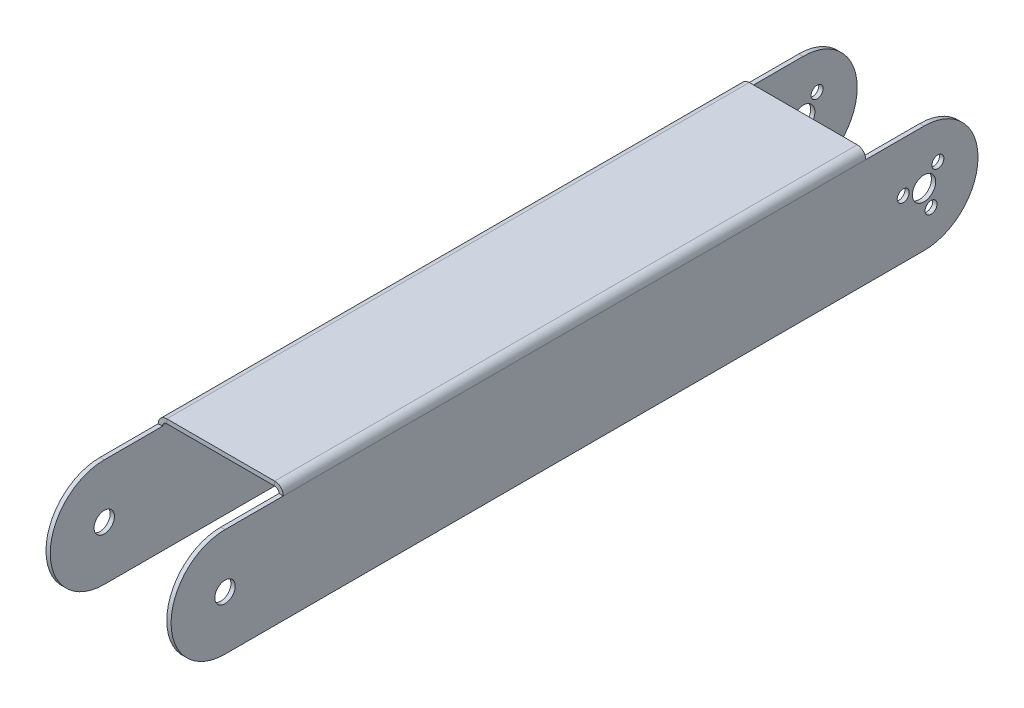
ISO-10303-21;
HEADER;
FILE_DESCRIPTION(('STEP AP214'),'2;1');
FILE_NAME('part.step','',(''),(''),'','','');
FILE_SCHEMA(('AUTOMOTIVE_DESIGN { 1 0 10303 214 1 1 1 1 }'));
ENDSEC;
DATA;
#1=APPLICATION_CONTEXT('core data for automotive mechanical design processes');
#2=APPLICATION_PROTOCOL_DEFINITION('international standard','automotive_design',2000,#1);
#3=PRODUCT_CONTEXT('',#1,'mechanical');
#4=PRODUCT('Part','Part','',(#3));
#5=PRODUCT_RELATED_PRODUCT_CATEGORY('part','',(#4));
#6=PRODUCT_DEFINITION_FORMATION('','',#4);
#7=PRODUCT_DEFINITION_CONTEXT('part definition',#1,'design');
#8=PRODUCT_DEFINITION('design','',#6,#7);
#9=PRODUCT_DEFINITION_SHAPE('','',#8);
#10=(LENGTH_UNIT() NAMED_UNIT(*) SI_UNIT(.MILLI.,.METRE.));
#11=(NAMED_UNIT(*) PLANE_ANGLE_UNIT() SI_UNIT($,.RADIAN.));
#12=(NAMED_UNIT(*) SI_UNIT($,.STERADIAN.) SOLID_ANGLE_UNIT());
#13=UNCERTAINTY_MEASURE_WITH_UNIT(LENGTH_MEASURE(1.E-05),#10,'distance_accuracy_value','');
#14=(GEOMETRIC_REPRESENTATION_CONTEXT(3) GLOBAL_UNCERTAINTY_ASSIGNED_CONTEXT((#13)) GLOBAL_UNIT_ASSIGNED_CONTEXT((#10,
#11,#12)) REPRESENTATION_CONTEXT('',''));
#15=CARTESIAN_POINT('',(0.,0.,0.));
#16=DIRECTION('',(0.,0.,1.));
#17=DIRECTION('',(1.,0.,0.));
#18=AXIS2_PLACEMENT_3D('',#15,#16,#17);
#19=CARTESIAN_POINT('',(10.7366,0.,0.));
#20=DIRECTION('',(-1.,0.,0.));
#21=DIRECTION('',(0.,-1.,0.));
#22=AXIS2_PLACEMENT_3D('',#19,#20,#21);
#23=PLANE('',#22);
#24=CARTESIAN_POINT('',(10.7366000000014,-10.0589967095719,-56.4222899495629));
#25=DIRECTION('',(1.,0.,0.));
#26=DIRECTION('',(0.,0.,-1.));
#27=AXIS2_PLACEMENT_3D('',#24,#25,#26);
#28=CIRCLE('',#27,1.02499999999999);
#29=CARTESIAN_POINT('',(10.7366000000014,-10.0589967095719,-57.4472899495629));
#30=VERTEX_POINT('',#29);
#31=EDGE_CURVE('E467',#30,#30,#28,.T.);
#32=ORIENTED_EDGE('',*,*,#31,.F.);
#33=EDGE_LOOP('',(#32));
#34=FACE_BOUND('',#33,.T.);
#35=CARTESIAN_POINT('',(10.7366,-10.7366,60.));
#36=DIRECTION('',(1.,0.,0.));
#37=DIRECTION('',(0.,1.,0.));
#38=AXIS2_PLACEMENT_3D('',#35,#36,#37);
#39=CIRCLE('',#38,1.75);
#40=CARTESIAN_POINT('',(10.7366,-8.9866,60.));
#41=VERTEX_POINT('',#40);
#42=EDGE_CURVE('E223',#41,#41,#39,.T.);
#43=ORIENTED_EDGE('',*,*,#42,.F.);
#44=EDGE_LOOP('',(#43));
#45=FACE_BOUND('',#44,.T.);
#46=CARTESIAN_POINT('',(10.7366,-10.7366,-60.));
#47=DIRECTION('',(-1.,0.,0.));
#48=DIRECTION('',(0.,-1.,0.));
#49=AXIS2_PLACEMENT_3D('',#46,#47,#48);
#50=CIRCLE('',#49,2.);
#51=CARTESIAN_POINT('',(10.7366,-12.7366,-60.));
#52=VERTEX_POINT('',#51);
#53=EDGE_CURVE('E249',#52,#52,#50,.T.);
#54=ORIENTED_EDGE('',*,*,#53,.T.);
#55=EDGE_LOOP('',(#54));
#56=FACE_BOUND('',#55,.T.);
#57=DIRECTION('',(0.,0.,1.));
#58=VECTOR('',#57,1.);
#59=CARTESIAN_POINT('',(10.7366,-1.47319999999999,-50.));
#60=LINE('',#59,#58);
#61=CARTESIAN_POINT('',(10.7366,-1.47319999999999,50.));
#62=VERTEX_POINT('',#61);
#63=CARTESIAN_POINT('',(10.7366,-1.47319999999999,-50.));
#64=VERTEX_POINT('',#63);
#65=EDGE_CURVE('E331',#62,#64,#60,.F.);
#66=ORIENTED_EDGE('',*,*,#65,.F.);
#67=DIRECTION('',(0.,0.,1.));
#68=VECTOR('',#67,1.);
#69=CARTESIAN_POINT('',(10.7366,-1.47319999999999,50.));
#70=LINE('',#69,#68);
#71=CARTESIAN_POINT('',(10.7366,-1.4732,60.));
#72=VERTEX_POINT('',#71);
#73=EDGE_CURVE('E231',#62,#72,#70,.T.);
#74=ORIENTED_EDGE('',*,*,#73,.T.);
#75=CARTESIAN_POINT('',(10.7366,-10.7366,60.));
#76=DIRECTION('',(1.,0.,0.));
#77=DIRECTION('',(0.,1.,0.));
#78=AXIS2_PLACEMENT_3D('',#75,#76,#77);
#79=CIRCLE('',#78,9.2634);
#80=CARTESIAN_POINT('',(10.7366000000001,-20.,60.));
#81=VERTEX_POINT('',#80);
#82=EDGE_CURVE('E238',#72,#81,#79,.T.);
#83=ORIENTED_EDGE('',*,*,#82,.T.);
#84=DIRECTION('',(0.,0.,-1.));
#85=VECTOR('',#84,1.);
#86=CARTESIAN_POINT('',(10.7366000000001,-20.,0.));
#87=LINE('',#86,#85);
#88=CARTESIAN_POINT('',(10.7366000000001,-20.,-60.));
#89=VERTEX_POINT('',#88);
#90=EDGE_CURVE('E326',#81,#89,#87,.T.);
#91=ORIENTED_EDGE('',*,*,#90,.T.);
#92=CARTESIAN_POINT('',(10.7366,-10.7366,-60.));
#93=DIRECTION('',(-1.,0.,0.));
#94=DIRECTION('',(0.,-1.,0.));
#95=AXIS2_PLACEMENT_3D('',#92,#93,#94);
#96=CIRCLE('',#95,9.2634);
#97=CARTESIAN_POINT('',(10.7366,-1.4732,-60.));
#98=VERTEX_POINT('',#97);
#99=EDGE_CURVE('E261',#98,#89,#96,.T.);
#100=ORIENTED_EDGE('',*,*,#99,.F.);
#101=DIRECTION('',(0.,0.,-1.));
#102=VECTOR('',#101,1.);
#103=CARTESIAN_POINT('',(10.7366,-1.47319999999999,-50.));
#104=LINE('',#103,#102);
#105=EDGE_CURVE('E254',#64,#98,#104,.T.);
#106=ORIENTED_EDGE('',*,*,#105,.F.);
#107=EDGE_LOOP('',(#66,#74,#83,#91,#100,#106));
#108=FACE_BOUND('',#107,.T.);
#109=CARTESIAN_POINT('',(10.7366000000014,-14.1737894362677,-61.2020333620201));
#110=DIRECTION('',(1.,0.,0.));
#111=DIRECTION('',(0.,0.,-1.));
#112=AXIS2_PLACEMENT_3D('',#109,#110,#111);
#113=CIRCLE('',#112,1.02499999999999);
#114=CARTESIAN_POINT('',(10.7366000000014,-14.1737894362677,-62.2270333620201));
#115=VERTEX_POINT('',#114);
#116=EDGE_CURVE('E446',#115,#115,#113,.T.);
#117=ORIENTED_EDGE('',*,*,#116,.F.);
#118=EDGE_LOOP('',(#117));
#119=FACE_BOUND('',#118,.T.);
#120=CARTESIAN_POINT('',(10.7366000000014,-7.97701385416052,-62.3756766884174));
#121=DIRECTION('',(1.,0.,0.));
#122=DIRECTION('',(0.,0.,-1.));
#123=AXIS2_PLACEMENT_3D('',#120,#121,#122);
#124=CIRCLE('',#123,1.02499999999999);
#125=CARTESIAN_POINT('',(10.7366000000014,-7.97701385416052,-63.4006766884174));
#126=VERTEX_POINT('',#125);
#127=EDGE_CURVE('E455',#126,#126,#124,.T.);
#128=ORIENTED_EDGE('',*,*,#127,.F.);
#129=EDGE_LOOP('',(#128));
#130=FACE_BOUND('',#129,.T.);
#131=ADVANCED_FACE('F77',(#34,#45,#56,#108,#119,#130),#23,.F.);
#132=CARTESIAN_POINT('',(-8.99999999999999,-0.7366,50.));
#133=DIRECTION('',(0.,0.,1.));
#134=DIRECTION('',(1.,0.,0.));
#135=AXIS2_PLACEMENT_3D('',#132,#133,#134);
#136=PLANE('',#135);
#137=DIRECTION('',(1.,0.,0.));
#138=VECTOR('',#137,1.);
#139=CARTESIAN_POINT('',(-8.99999999999999,0.,50.));
#140=LINE('',#139,#138);
#141=CARTESIAN_POINT('',(-9.26340000000001,0.,50.));
#142=VERTEX_POINT('',#141);
#143=CARTESIAN_POINT('',(9.26340000000001,0.,50.));
#144=VERTEX_POINT('',#143);
#145=EDGE_CURVE('E362',#142,#144,#140,.T.);
#146=ORIENTED_EDGE('',*,*,#145,.F.);
#147=DIRECTION('',(0.,1.,0.));
#148=VECTOR('',#147,1.);
#149=CARTESIAN_POINT('',(-9.26340000000001,-0.736600000000003,50.));
#150=LINE('',#149,#148);
#151=CARTESIAN_POINT('',(-9.26340000000001,-0.736600000000003,50.));
#152=VERTEX_POINT('',#151);
#153=EDGE_CURVE('E321',#152,#142,#150,.T.);
#154=ORIENTED_EDGE('',*,*,#153,.F.);
#155=DIRECTION('',(1.,0.,0.));
#156=VECTOR('',#155,1.);
#157=CARTESIAN_POINT('',(-8.99999999999999,-0.7366,50.));
#158=LINE('',#157,#156);
#159=CARTESIAN_POINT('',(9.26340000000001,-0.736600000000005,50.));
#160=VERTEX_POINT('',#159);
#161=EDGE_CURVE('E13',#152,#160,#158,.T.);
#162=ORIENTED_EDGE('',*,*,#161,.T.);
#163=DIRECTION('',(0.,1.,0.));
#164=VECTOR('',#163,1.);
#165=CARTESIAN_POINT('',(9.26340000000001,-0.736600000000005,50.));
#166=LINE('',#165,#164);
#167=EDGE_CURVE('E346',#160,#144,#166,.T.);
#168=ORIENTED_EDGE('',*,*,#167,.T.);
#169=EDGE_LOOP('',(#146,#154,#162,#168));
#170=FACE_BOUND('',#169,.T.);
#171=ADVANCED_FACE('F371',(#170),#136,.T.);
#172=CARTESIAN_POINT('',(-9.00000000000001,-0.7366,-50.));
#173=DIRECTION('',(0.,0.,-1.));
#174=DIRECTION('',(-1.,0.,0.));
#175=AXIS2_PLACEMENT_3D('',#172,#173,#174);
#176=PLANE('',#175);
#177=DIRECTION('',(-1.,0.,0.));
#178=VECTOR('',#177,1.);
#179=CARTESIAN_POINT('',(-9.00000000000001,0.,-50.));
#180=LINE('',#179,#178);
#181=CARTESIAN_POINT('',(9.26340000000001,0.,-50.));
#182=VERTEX_POINT('',#181);
#183=CARTESIAN_POINT('',(-9.26340000000001,0.,-50.));
#184=VERTEX_POINT('',#183);
#185=EDGE_CURVE('E358',#182,#184,#180,.T.);
#186=ORIENTED_EDGE('',*,*,#185,.F.);
#187=DIRECTION('',(0.,1.,0.));
#188=VECTOR('',#187,1.);
#189=CARTESIAN_POINT('',(9.26340000000001,-0.736600000000005,-50.));
#190=LINE('',#189,#188);
#191=CARTESIAN_POINT('',(9.26340000000001,-0.736600000000005,-50.));
#192=VERTEX_POINT('',#191);
#193=EDGE_CURVE('E356',#192,#182,#190,.T.);
#194=ORIENTED_EDGE('',*,*,#193,.F.);
#195=DIRECTION('',(-1.,0.,0.));
#196=VECTOR('',#195,1.);
#197=CARTESIAN_POINT('',(-9.00000000000001,-0.7366,-50.));
#198=LINE('',#197,#196);
#199=CARTESIAN_POINT('',(-9.26340000000001,-0.736600000000003,-50.));
#200=VERTEX_POINT('',#199);
#201=EDGE_CURVE('E86',#192,#200,#198,.T.);
#202=ORIENTED_EDGE('',*,*,#201,.T.);
#203=DIRECTION('',(0.,1.,0.));
#204=VECTOR('',#203,1.);
#205=CARTESIAN_POINT('',(-9.26340000000001,-0.736600000000003,-50.));
#206=LINE('',#205,#204);
#207=EDGE_CURVE('E311',#200,#184,#206,.T.);
#208=ORIENTED_EDGE('',*,*,#207,.T.);
#209=EDGE_LOOP('',(#186,#194,#202,#208));
#210=FACE_BOUND('',#209,.T.);
#211=ADVANCED_FACE('F79',(#210),#176,.T.);
#212=CARTESIAN_POINT('',(0.,-0.7366,0.));
#213=DIRECTION('',(0.,1.,0.));
#214=DIRECTION('',(0.,0.,1.));
#215=AXIS2_PLACEMENT_3D('',#212,#213,#214);
#216=PLANE('',#215);
#217=ORIENTED_EDGE('',*,*,#201,.F.);
#218=DIRECTION('',(0.,0.,1.));
#219=VECTOR('',#218,1.);
#220=CARTESIAN_POINT('',(9.26340000000001,-0.736600000000005,50.));
#221=LINE('',#220,#219);
#222=EDGE_CURVE('E352',#160,#192,#221,.F.);
#223=ORIENTED_EDGE('',*,*,#222,.F.);
#224=ORIENTED_EDGE('',*,*,#161,.F.);
#225=DIRECTION('',(0.,0.,-1.));
#226=VECTOR('',#225,1.);
#227=CARTESIAN_POINT('',(-9.26340000000001,-0.736600000000003,-50.));
#228=LINE('',#227,#226);
#229=EDGE_CURVE('E317',#200,#152,#228,.F.);
#230=ORIENTED_EDGE('',*,*,#229,.F.);
#231=EDGE_LOOP('',(#217,#223,#224,#230));
#232=FACE_BOUND('',#231,.T.);
#233=ADVANCED_FACE('F538',(#232),#216,.F.);
#234=CARTESIAN_POINT('',(0.,0.,0.));
#235=DIRECTION('',(0.,1.,0.));
#236=DIRECTION('',(0.,0.,1.));
#237=AXIS2_PLACEMENT_3D('',#234,#235,#236);
#238=PLANE('',#237);
#239=ORIENTED_EDGE('',*,*,#145,.T.);
#240=DIRECTION('',(0.,0.,1.));
#241=VECTOR('',#240,1.);
#242=CARTESIAN_POINT('',(9.26340000000001,0.,50.));
#243=LINE('',#242,#241);
#244=EDGE_CURVE('E341',#144,#182,#243,.F.);
#245=ORIENTED_EDGE('',*,*,#244,.T.);
#246=ORIENTED_EDGE('',*,*,#185,.T.);
#247=DIRECTION('',(0.,0.,-1.));
#248=VECTOR('',#247,1.);
#249=CARTESIAN_POINT('',(-9.26340000000001,0.,-50.));
#250=LINE('',#249,#248);
#251=EDGE_CURVE('E306',#184,#142,#250,.F.);
#252=ORIENTED_EDGE('',*,*,#251,.T.);
#253=EDGE_LOOP('',(#239,#245,#246,#252));
#254=FACE_BOUND('',#253,.T.);
#255=ADVANCED_FACE('F368',(#254),#238,.T.);
#256=CARTESIAN_POINT('',(9.2634,-1.4732,-50.));
#257=DIRECTION('',(0.,0.,-1.));
#258=DIRECTION('',(-1.,0.,0.));
#259=AXIS2_PLACEMENT_3D('',#256,#257,#258);
#260=PLANE('',#259);
#261=DIRECTION('',(-1.,0.,0.));
#262=VECTOR('',#261,1.);
#263=CARTESIAN_POINT('',(10.7366,-1.47319999999999,-50.));
#264=LINE('',#263,#262);
#265=CARTESIAN_POINT('',(9.99999999999999,-1.4732,-50.));
#266=VERTEX_POINT('',#265);
#267=EDGE_CURVE('E323',#266,#64,#264,.F.);
#268=ORIENTED_EDGE('',*,*,#267,.F.);
#269=CARTESIAN_POINT('',(9.2634,-1.4732,-50.));
#270=DIRECTION('',(0.,0.,1.));
#271=DIRECTION('',(1.,0.,0.));
#272=AXIS2_PLACEMENT_3D('',#269,#270,#271);
#273=CIRCLE('',#272,0.736599999999993);
#274=EDGE_CURVE('E349',#192,#266,#273,.F.);
#275=ORIENTED_EDGE('',*,*,#274,.F.);
#276=ORIENTED_EDGE('',*,*,#193,.T.);
#277=CARTESIAN_POINT('',(9.2634,-1.4732,-50.));
#278=DIRECTION('',(0.,0.,1.));
#279=DIRECTION('',(1.,0.,0.));
#280=AXIS2_PLACEMENT_3D('',#277,#278,#279);
#281=CIRCLE('',#280,1.47319999999999);
#282=EDGE_CURVE('E94',#182,#64,#281,.F.);
#283=ORIENTED_EDGE('',*,*,#282,.T.);
#284=EDGE_LOOP('',(#268,#275,#276,#283));
#285=FACE_BOUND('',#284,.T.);
#286=ADVANCED_FACE('F408',(#285),#260,.T.);
#287=CARTESIAN_POINT('',(9.2634,-1.4732,50.));
#288=DIRECTION('',(0.,0.,-1.));
#289=DIRECTION('',(-1.,0.,0.));
#290=AXIS2_PLACEMENT_3D('',#287,#288,#289);
#291=PLANE('',#290);
#292=CARTESIAN_POINT('',(9.2634,-1.4732,50.));
#293=DIRECTION('',(0.,0.,1.));
#294=DIRECTION('',(1.,0.,0.));
#295=AXIS2_PLACEMENT_3D('',#292,#293,#294);
#296=CIRCLE('',#295,0.736599999999993);
#297=CARTESIAN_POINT('',(10.,-1.4732,50.));
#298=VERTEX_POINT('',#297);
#299=EDGE_CURVE('E328',#298,#160,#296,.T.);
#300=ORIENTED_EDGE('',*,*,#299,.F.);
#301=DIRECTION('',(-1.,0.,0.));
#302=VECTOR('',#301,1.);
#303=CARTESIAN_POINT('',(10.,-1.47319999999999,50.));
#304=LINE('',#303,#302);
#305=EDGE_CURVE('E333',#298,#62,#304,.F.);
#306=ORIENTED_EDGE('',*,*,#305,.T.);
#307=CARTESIAN_POINT('',(9.2634,-1.4732,50.));
#308=DIRECTION('',(0.,0.,1.));
#309=DIRECTION('',(1.,0.,0.));
#310=AXIS2_PLACEMENT_3D('',#307,#308,#309);
#311=CIRCLE('',#310,1.47319999999999);
#312=EDGE_CURVE('E344',#62,#144,#311,.T.);
#313=ORIENTED_EDGE('',*,*,#312,.T.);
#314=ORIENTED_EDGE('',*,*,#167,.F.);
#315=EDGE_LOOP('',(#300,#306,#313,#314));
#316=FACE_BOUND('',#315,.T.);
#317=ADVANCED_FACE('F376',(#316),#291,.F.);
#318=CARTESIAN_POINT('',(9.2634,-1.4732,50.));
#319=DIRECTION('',(0.,0.,1.));
#320=DIRECTION('',(1.,0.,0.));
#321=AXIS2_PLACEMENT_3D('',#318,#319,#320);
#322=CYLINDRICAL_SURFACE('',#321,1.47319999999999);
#323=ORIENTED_EDGE('',*,*,#244,.F.);
#324=ORIENTED_EDGE('',*,*,#312,.F.);
#325=ORIENTED_EDGE('',*,*,#65,.T.);
#326=ORIENTED_EDGE('',*,*,#282,.F.);
#327=EDGE_LOOP('',(#323,#324,#325,#326));
#328=FACE_BOUND('',#327,.T.);
#329=ADVANCED_FACE('F406',(#328),#322,.T.);
#330=CARTESIAN_POINT('',(9.2634,-1.4732,50.));
#331=DIRECTION('',(0.,0.,1.));
#332=DIRECTION('',(1.,0.,0.));
#333=AXIS2_PLACEMENT_3D('',#330,#331,#332);
#334=CYLINDRICAL_SURFACE('',#333,0.736599999999993);
#335=ORIENTED_EDGE('',*,*,#222,.T.);
#336=ORIENTED_EDGE('',*,*,#274,.T.);
#337=DIRECTION('',(0.,0.,1.));
#338=VECTOR('',#337,1.);
#339=CARTESIAN_POINT('',(10.,-1.4732,-50.));
#340=LINE('',#339,#338);
#341=EDGE_CURVE('E336',#266,#298,#340,.T.);
#342=ORIENTED_EDGE('',*,*,#341,.T.);
#343=ORIENTED_EDGE('',*,*,#299,.T.);
#344=EDGE_LOOP('',(#335,#336,#342,#343));
#345=FACE_BOUND('',#344,.T.);
#346=ADVANCED_FACE('F379',(#345),#334,.F.);
#347=CARTESIAN_POINT('',(10.,0.,0.));
#348=DIRECTION('',(-1.,0.,0.));
#349=DIRECTION('',(0.,-1.,0.));
#350=AXIS2_PLACEMENT_3D('',#347,#348,#349);
#351=PLANE('',#350);
#352=CARTESIAN_POINT('',(10.,-10.0589967095719,-56.4222899495629));
#353=DIRECTION('',(-1.,0.,0.));
#354=DIRECTION('',(0.,-1.,0.));
#355=AXIS2_PLACEMENT_3D('',#352,#353,#354);
#356=CIRCLE('',#355,1.02499999999999);
#357=CARTESIAN_POINT('',(10.,-11.0839967095719,-56.4222899495629));
#358=VERTEX_POINT('',#357);
#359=EDGE_CURVE('E461',#358,#358,#356,.T.);
#360=ORIENTED_EDGE('',*,*,#359,.F.);
#361=EDGE_LOOP('',(#360));
#362=FACE_BOUND('',#361,.T.);
#363=CARTESIAN_POINT('',(10.,-7.97701385416052,-62.3756766884174));
#364=DIRECTION('',(-1.,0.,0.));
#365=DIRECTION('',(0.,-1.,0.));
#366=AXIS2_PLACEMENT_3D('',#363,#364,#365);
#367=CIRCLE('',#366,1.02499999999999);
#368=CARTESIAN_POINT('',(10.,-9.00201385416052,-62.3756766884174));
#369=VERTEX_POINT('',#368);
#370=EDGE_CURVE('E81',#369,#369,#367,.T.);
#371=ORIENTED_EDGE('',*,*,#370,.F.);
#372=EDGE_LOOP('',(#371));
#373=FACE_BOUND('',#372,.T.);
#374=CARTESIAN_POINT('',(10.,-14.1737894362677,-61.2020333620201));
#375=DIRECTION('',(-1.,0.,0.));
#376=DIRECTION('',(0.,-1.,0.));
#377=AXIS2_PLACEMENT_3D('',#374,#375,#376);
#378=CIRCLE('',#377,1.02499999999999);
#379=CARTESIAN_POINT('',(10.,-15.1987894362677,-61.2020333620201));
#380=VERTEX_POINT('',#379);
#381=EDGE_CURVE('E440',#380,#380,#378,.T.);
#382=ORIENTED_EDGE('',*,*,#381,.F.);
#383=EDGE_LOOP('',(#382));
#384=FACE_BOUND('',#383,.T.);
#385=DIRECTION('',(0.,0.,1.));
#386=VECTOR('',#385,1.);
#387=CARTESIAN_POINT('',(10.0000000000001,-20.,-50.));
#388=LINE('',#387,#386);
#389=CARTESIAN_POINT('',(10.0000000000001,-20.,60.));
#390=VERTEX_POINT('',#389);
#391=CARTESIAN_POINT('',(10.0000000000001,-20.,-60.));
#392=VERTEX_POINT('',#391);
#393=EDGE_CURVE('E329',#390,#392,#388,.F.);
#394=ORIENTED_EDGE('',*,*,#393,.F.);
#395=CARTESIAN_POINT('',(10.,-10.7366,60.));
#396=DIRECTION('',(1.,0.,0.));
#397=DIRECTION('',(0.,1.,0.));
#398=AXIS2_PLACEMENT_3D('',#395,#396,#397);
#399=CIRCLE('',#398,9.2634);
#400=CARTESIAN_POINT('',(10.,-1.4732,60.));
#401=VERTEX_POINT('',#400);
#402=EDGE_CURVE('E237',#401,#390,#399,.T.);
#403=ORIENTED_EDGE('',*,*,#402,.F.);
#404=DIRECTION('',(0.,0.,1.));
#405=VECTOR('',#404,1.);
#406=CARTESIAN_POINT('',(10.,-1.4732,50.));
#407=LINE('',#406,#405);
#408=EDGE_CURVE('E234',#298,#401,#407,.T.);
#409=ORIENTED_EDGE('',*,*,#408,.F.);
#410=ORIENTED_EDGE('',*,*,#341,.F.);
#411=DIRECTION('',(0.,0.,-1.));
#412=VECTOR('',#411,1.);
#413=CARTESIAN_POINT('',(10.,-1.4732,-50.));
#414=LINE('',#413,#412);
#415=CARTESIAN_POINT('',(10.,-1.4732,-60.));
#416=VERTEX_POINT('',#415);
#417=EDGE_CURVE('E257',#266,#416,#414,.T.);
#418=ORIENTED_EDGE('',*,*,#417,.T.);
#419=CARTESIAN_POINT('',(10.,-10.7366,-60.));
#420=DIRECTION('',(-1.,0.,0.));
#421=DIRECTION('',(0.,-1.,0.));
#422=AXIS2_PLACEMENT_3D('',#419,#420,#421);
#423=CIRCLE('',#422,9.2634);
#424=EDGE_CURVE('E260',#416,#392,#423,.T.);
#425=ORIENTED_EDGE('',*,*,#424,.T.);
#426=EDGE_LOOP('',(#394,#403,#409,#410,#418,#425));
#427=FACE_BOUND('',#426,.T.);
#428=CARTESIAN_POINT('',(10.,-10.7366,-60.));
#429=DIRECTION('',(-1.,0.,0.));
#430=DIRECTION('',(0.,-1.,0.));
#431=AXIS2_PLACEMENT_3D('',#428,#429,#430);
#432=CIRCLE('',#431,2.);
#433=CARTESIAN_POINT('',(10.,-12.7366,-60.));
#434=VERTEX_POINT('',#433);
#435=EDGE_CURVE('E251',#434,#434,#432,.T.);
#436=ORIENTED_EDGE('',*,*,#435,.F.);
#437=EDGE_LOOP('',(#436));
#438=FACE_BOUND('',#437,.T.);
#439=CARTESIAN_POINT('',(10.,-10.7366,60.));
#440=DIRECTION('',(1.,0.,0.));
#441=DIRECTION('',(0.,1.,0.));
#442=AXIS2_PLACEMENT_3D('',#439,#440,#441);
#443=CIRCLE('',#442,1.75);
#444=CARTESIAN_POINT('',(10.,-8.9866,60.));
#445=VERTEX_POINT('',#444);
#446=EDGE_CURVE('E228',#445,#445,#443,.T.);
#447=ORIENTED_EDGE('',*,*,#446,.T.);
#448=EDGE_LOOP('',(#447));
#449=FACE_BOUND('',#448,.T.);
#450=ADVANCED_FACE('F385',(#362,#373,#384,#427,#438,#449),#351,.T.);
#451=CARTESIAN_POINT('',(10.7366000000001,-20.,-50.));
#452=DIRECTION('',(0.,1.,0.));
#453=DIRECTION('',(-1.,0.,0.));
#454=AXIS2_PLACEMENT_3D('',#451,#452,#453);
#455=PLANE('',#454);
#456=ORIENTED_EDGE('',*,*,#393,.T.);
#457=DIRECTION('',(1.,0.,0.));
#458=VECTOR('',#457,1.);
#459=CARTESIAN_POINT('',(10.0000000000001,-20.,-60.));
#460=LINE('',#459,#458);
#461=EDGE_CURVE('E264',#392,#89,#460,.T.);
#462=ORIENTED_EDGE('',*,*,#461,.T.);
#463=ORIENTED_EDGE('',*,*,#90,.F.);
#464=DIRECTION('',(1.,0.,0.));
#465=VECTOR('',#464,1.);
#466=CARTESIAN_POINT('',(10.0000000000001,-20.,60.));
#467=LINE('',#466,#465);
#468=EDGE_CURVE('E246',#390,#81,#467,.T.);
#469=ORIENTED_EDGE('',*,*,#468,.F.);
#470=EDGE_LOOP('',(#456,#462,#463,#469));
#471=FACE_BOUND('',#470,.T.);
#472=ADVANCED_FACE('F397',(#471),#455,.F.);
#473=CARTESIAN_POINT('',(-9.2634,-1.4732,50.));
#474=DIRECTION('',(0.,0.,1.));
#475=DIRECTION('',(1.,0.,0.));
#476=AXIS2_PLACEMENT_3D('',#473,#474,#475);
#477=PLANE('',#476);
#478=DIRECTION('',(1.,0.,0.));
#479=VECTOR('',#478,1.);
#480=CARTESIAN_POINT('',(-10.7366,-1.47319999999999,50.));
#481=LINE('',#480,#479);
#482=CARTESIAN_POINT('',(-10.,-1.4732,50.));
#483=VERTEX_POINT('',#482);
#484=CARTESIAN_POINT('',(-10.7366,-1.47319999999999,50.));
#485=VERTEX_POINT('',#484);
#486=EDGE_CURVE('E293',#483,#485,#481,.F.);
#487=ORIENTED_EDGE('',*,*,#486,.F.);
#488=CARTESIAN_POINT('',(-9.2634,-1.4732,50.));
#489=DIRECTION('',(0.,0.,-1.));
#490=DIRECTION('',(-1.,0.,0.));
#491=AXIS2_PLACEMENT_3D('',#488,#489,#490);
#492=CIRCLE('',#491,0.736599999999995);
#493=EDGE_CURVE('E314',#152,#483,#492,.F.);
#494=ORIENTED_EDGE('',*,*,#493,.F.);
#495=ORIENTED_EDGE('',*,*,#153,.T.);
#496=CARTESIAN_POINT('',(-9.2634,-1.4732,50.));
#497=DIRECTION('',(0.,0.,-1.));
#498=DIRECTION('',(-1.,0.,0.));
#499=AXIS2_PLACEMENT_3D('',#496,#497,#498);
#500=CIRCLE('',#499,1.4732);
#501=EDGE_CURVE('E102',#142,#485,#500,.F.);
#502=ORIENTED_EDGE('',*,*,#501,.T.);
#503=EDGE_LOOP('',(#487,#494,#495,#502));
#504=FACE_BOUND('',#503,.T.);
#505=ADVANCED_FACE('F519',(#504),#477,.T.);
#506=CARTESIAN_POINT('',(-9.2634,-1.4732,-50.));
#507=DIRECTION('',(0.,0.,1.));
#508=DIRECTION('',(1.,0.,0.));
#509=AXIS2_PLACEMENT_3D('',#506,#507,#508);
#510=PLANE('',#509);
#511=CARTESIAN_POINT('',(-9.2634,-1.4732,-50.));
#512=DIRECTION('',(0.,0.,-1.));
#513=DIRECTION('',(-1.,0.,0.));
#514=AXIS2_PLACEMENT_3D('',#511,#512,#513);
#515=CIRCLE('',#514,0.736599999999995);
#516=CARTESIAN_POINT('',(-10.,-1.4732,-50.));
#517=VERTEX_POINT('',#516);
#518=EDGE_CURVE('E295',#517,#200,#515,.T.);
#519=ORIENTED_EDGE('',*,*,#518,.F.);
#520=DIRECTION('',(1.,0.,0.));
#521=VECTOR('',#520,1.);
#522=CARTESIAN_POINT('',(-10.,-1.47319999999999,-50.));
#523=LINE('',#522,#521);
#524=CARTESIAN_POINT('',(-10.7366,-1.47319999999999,-50.));
#525=VERTEX_POINT('',#524);
#526=EDGE_CURVE('E298',#517,#525,#523,.F.);
#527=ORIENTED_EDGE('',*,*,#526,.T.);
#528=CARTESIAN_POINT('',(-9.2634,-1.4732,-50.));
#529=DIRECTION('',(0.,0.,-1.));
#530=DIRECTION('',(-1.,0.,0.));
#531=AXIS2_PLACEMENT_3D('',#528,#529,#530);
#532=CIRCLE('',#531,1.4732);
#533=EDGE_CURVE('E309',#525,#184,#532,.T.);
#534=ORIENTED_EDGE('',*,*,#533,.T.);
#535=ORIENTED_EDGE('',*,*,#207,.F.);
#536=EDGE_LOOP('',(#519,#527,#534,#535));
#537=FACE_BOUND('',#536,.T.);
#538=ADVANCED_FACE('F416',(#537),#510,.F.);
#539=CARTESIAN_POINT('',(-9.2634,-1.4732,-50.));
#540=DIRECTION('',(0.,0.,-1.));
#541=DIRECTION('',(-1.,0.,0.));
#542=AXIS2_PLACEMENT_3D('',#539,#540,#541);
#543=CYLINDRICAL_SURFACE('',#542,1.4732);
#544=ORIENTED_EDGE('',*,*,#251,.F.);
#545=ORIENTED_EDGE('',*,*,#533,.F.);
#546=DIRECTION('',(0.,0.,-1.));
#547=VECTOR('',#546,1.);
#548=CARTESIAN_POINT('',(-10.7366,-1.47319999999999,50.));
#549=LINE('',#548,#547);
#550=EDGE_CURVE('E203',#525,#485,#549,.F.);
#551=ORIENTED_EDGE('',*,*,#550,.T.);
#552=ORIENTED_EDGE('',*,*,#501,.F.);
#553=EDGE_LOOP('',(#544,#545,#551,#552));
#554=FACE_BOUND('',#553,.T.);
#555=ADVANCED_FACE('F514',(#554),#543,.T.);
#556=CARTESIAN_POINT('',(-9.2634,-1.4732,-50.));
#557=DIRECTION('',(0.,0.,-1.));
#558=DIRECTION('',(-1.,0.,0.));
#559=AXIS2_PLACEMENT_3D('',#556,#557,#558);
#560=CYLINDRICAL_SURFACE('',#559,0.736599999999995);
#561=ORIENTED_EDGE('',*,*,#229,.T.);
#562=ORIENTED_EDGE('',*,*,#493,.T.);
#563=DIRECTION('',(0.,0.,-1.));
#564=VECTOR('',#563,1.);
#565=CARTESIAN_POINT('',(-10.,-1.4732,50.));
#566=LINE('',#565,#564);
#567=EDGE_CURVE('E301',#483,#517,#566,.T.);
#568=ORIENTED_EDGE('',*,*,#567,.T.);
#569=ORIENTED_EDGE('',*,*,#518,.T.);
#570=EDGE_LOOP('',(#561,#562,#568,#569));
#571=FACE_BOUND('',#570,.T.);
#572=ADVANCED_FACE('F419',(#571),#560,.F.);
#573=CARTESIAN_POINT('',(-10.7366,0.,0.));
#574=DIRECTION('',(1.,0.,0.));
#575=DIRECTION('',(0.,1.,0.));
#576=AXIS2_PLACEMENT_3D('',#573,#574,#575);
#577=PLANE('',#576);
#578=CARTESIAN_POINT('',(-10.7365999999989,-10.0589967095719,-56.4222899495629));
#579=DIRECTION('',(1.,0.,0.));
#580=DIRECTION('',(0.,0.,-1.));
#581=AXIS2_PLACEMENT_3D('',#578,#579,#580);
#582=CIRCLE('',#581,1.02499999999999);
#583=CARTESIAN_POINT('',(-10.7365999999989,-10.0589967095719,-57.4472899495629));
#584=VERTEX_POINT('',#583);
#585=EDGE_CURVE('E464',#584,#584,#582,.T.);
#586=ORIENTED_EDGE('',*,*,#585,.T.);
#587=EDGE_LOOP('',(#586));
#588=FACE_BOUND('',#587,.T.);
#589=CARTESIAN_POINT('',(-10.7365999999989,-7.97701385416052,-62.3756766884174));
#590=DIRECTION('',(1.,0.,0.));
#591=DIRECTION('',(0.,0.,-1.));
#592=AXIS2_PLACEMENT_3D('',#589,#590,#591);
#593=CIRCLE('',#592,1.02499999999999);
#594=CARTESIAN_POINT('',(-10.7365999999989,-7.97701385416052,-63.4006766884174));
#595=VERTEX_POINT('',#594);
#596=EDGE_CURVE('E452',#595,#595,#593,.T.);
#597=ORIENTED_EDGE('',*,*,#596,.T.);
#598=EDGE_LOOP('',(#597));
#599=FACE_BOUND('',#598,.T.);
#600=CARTESIAN_POINT('',(-10.7365999999989,-14.1737894362677,-61.2020333620201));
#601=DIRECTION('',(1.,0.,0.));
#602=DIRECTION('',(0.,0.,-1.));
#603=AXIS2_PLACEMENT_3D('',#600,#601,#602);
#604=CIRCLE('',#603,1.02499999999999);
#605=CARTESIAN_POINT('',(-10.7365999999989,-14.1737894362677,-62.2270333620201));
#606=VERTEX_POINT('',#605);
#607=EDGE_CURVE('E443',#606,#606,#604,.T.);
#608=ORIENTED_EDGE('',*,*,#607,.T.);
#609=EDGE_LOOP('',(#608));
#610=FACE_BOUND('',#609,.T.);
#611=ORIENTED_EDGE('',*,*,#550,.F.);
#612=DIRECTION('',(0.,0.,-1.));
#613=VECTOR('',#612,1.);
#614=CARTESIAN_POINT('',(-10.7366,-1.47319999999999,-50.));
#615=LINE('',#614,#613);
#616=CARTESIAN_POINT('',(-10.7366,-1.4732,-60.));
#617=VERTEX_POINT('',#616);
#618=EDGE_CURVE('E278',#525,#617,#615,.T.);
#619=ORIENTED_EDGE('',*,*,#618,.T.);
#620=CARTESIAN_POINT('',(-10.7366,-10.7366,-60.));
#621=DIRECTION('',(-1.,0.,0.));
#622=DIRECTION('',(0.,-1.,0.));
#623=AXIS2_PLACEMENT_3D('',#620,#621,#622);
#624=CIRCLE('',#623,9.2634);
#625=CARTESIAN_POINT('',(-10.7366000000001,-20.,-60.));
#626=VERTEX_POINT('',#625);
#627=EDGE_CURVE('E285',#617,#626,#624,.T.);
#628=ORIENTED_EDGE('',*,*,#627,.T.);
#629=DIRECTION('',(0.,0.,1.));
#630=VECTOR('',#629,1.);
#631=CARTESIAN_POINT('',(-10.7366000000001,-20.,0.));
#632=LINE('',#631,#630);
#633=CARTESIAN_POINT('',(-10.7366000000001,-20.,60.));
#634=VERTEX_POINT('',#633);
#635=EDGE_CURVE('E202',#626,#634,#632,.T.);
#636=ORIENTED_EDGE('',*,*,#635,.T.);
#637=CARTESIAN_POINT('',(-10.7366,-10.7366,60.));
#638=DIRECTION('',(1.,0.,0.));
#639=DIRECTION('',(0.,1.,0.));
#640=AXIS2_PLACEMENT_3D('',#637,#638,#639);
#641=CIRCLE('',#640,9.2634);
#642=CARTESIAN_POINT('',(-10.7366,-1.4732,60.));
#643=VERTEX_POINT('',#642);
#644=EDGE_CURVE('E220',#643,#634,#641,.T.);
#645=ORIENTED_EDGE('',*,*,#644,.F.);
#646=DIRECTION('',(0.,0.,1.));
#647=VECTOR('',#646,1.);
#648=CARTESIAN_POINT('',(-10.7366,-1.47319999999999,50.));
#649=LINE('',#648,#647);
#650=EDGE_CURVE('E215',#485,#643,#649,.T.);
#651=ORIENTED_EDGE('',*,*,#650,.F.);
#652=EDGE_LOOP('',(#611,#619,#628,#636,#645,#651));
#653=FACE_BOUND('',#652,.T.);
#654=CARTESIAN_POINT('',(-10.7366,-10.7366,-60.));
#655=DIRECTION('',(-1.,0.,0.));
#656=DIRECTION('',(0.,-1.,0.));
#657=AXIS2_PLACEMENT_3D('',#654,#655,#656);
#658=CIRCLE('',#657,2.);
#659=CARTESIAN_POINT('',(-10.7366,-12.7366,-60.));
#660=VERTEX_POINT('',#659);
#661=EDGE_CURVE('E272',#660,#660,#658,.T.);
#662=ORIENTED_EDGE('',*,*,#661,.F.);
#663=EDGE_LOOP('',(#662));
#664=FACE_BOUND('',#663,.T.);
#665=CARTESIAN_POINT('',(-10.7366,-10.7366,60.));
#666=DIRECTION('',(1.,0.,0.));
#667=DIRECTION('',(0.,1.,0.));
#668=AXIS2_PLACEMENT_3D('',#665,#666,#667);
#669=CIRCLE('',#668,1.75);
#670=CARTESIAN_POINT('',(-10.7366,-8.9866,60.));
#671=VERTEX_POINT('',#670);
#672=EDGE_CURVE('E432',#671,#671,#669,.T.);
#673=ORIENTED_EDGE('',*,*,#672,.T.);
#674=EDGE_LOOP('',(#673));
#675=FACE_BOUND('',#674,.T.);
#676=ADVANCED_FACE('F427',(#588,#599,#610,#653,#664,#675),#577,.F.);
#677=CARTESIAN_POINT('',(-10.,0.,0.));
#678=DIRECTION('',(1.,0.,0.));
#679=DIRECTION('',(0.,1.,0.));
#680=AXIS2_PLACEMENT_3D('',#677,#678,#679);
#681=PLANE('',#680);
#682=CARTESIAN_POINT('',(-10.,-10.0589967095719,-56.4222899495629));
#683=DIRECTION('',(1.,0.,0.));
#684=DIRECTION('',(0.,1.,0.));
#685=AXIS2_PLACEMENT_3D('',#682,#683,#684);
#686=CIRCLE('',#685,1.02499999999999);
#687=CARTESIAN_POINT('',(-10.,-9.03399670957195,-56.4222899495629));
#688=VERTEX_POINT('',#687);
#689=EDGE_CURVE('E458',#688,#688,#686,.T.);
#690=ORIENTED_EDGE('',*,*,#689,.F.);
#691=EDGE_LOOP('',(#690));
#692=FACE_BOUND('',#691,.T.);
#693=CARTESIAN_POINT('',(-10.,-7.97701385416052,-62.3756766884174));
#694=DIRECTION('',(1.,0.,0.));
#695=DIRECTION('',(0.,1.,0.));
#696=AXIS2_PLACEMENT_3D('',#693,#694,#695);
#697=CIRCLE('',#696,1.02499999999999);
#698=CARTESIAN_POINT('',(-10.,-6.95201385416053,-62.3756766884174));
#699=VERTEX_POINT('',#698);
#700=EDGE_CURVE('E449',#699,#699,#697,.T.);
#701=ORIENTED_EDGE('',*,*,#700,.F.);
#702=EDGE_LOOP('',(#701));
#703=FACE_BOUND('',#702,.T.);
#704=CARTESIAN_POINT('',(-10.0000000000001,-14.1737894362677,-61.2020333620201));
#705=DIRECTION('',(1.,0.,0.));
#706=DIRECTION('',(0.,1.,0.));
#707=AXIS2_PLACEMENT_3D('',#704,#705,#706);
#708=CIRCLE('',#707,1.02499999999999);
#709=CARTESIAN_POINT('',(-10.,-13.1487894362677,-61.2020333620201));
#710=VERTEX_POINT('',#709);
#711=EDGE_CURVE('E436',#710,#710,#708,.T.);
#712=ORIENTED_EDGE('',*,*,#711,.F.);
#713=EDGE_LOOP('',(#712));
#714=FACE_BOUND('',#713,.T.);
#715=DIRECTION('',(0.,0.,-1.));
#716=VECTOR('',#715,1.);
#717=CARTESIAN_POINT('',(-10.0000000000001,-20.,50.));
#718=LINE('',#717,#716);
#719=CARTESIAN_POINT('',(-10.0000000000001,-20.,-60.));
#720=VERTEX_POINT('',#719);
#721=CARTESIAN_POINT('',(-10.0000000000001,-20.,60.));
#722=VERTEX_POINT('',#721);
#723=EDGE_CURVE('E192',#720,#722,#718,.F.);
#724=ORIENTED_EDGE('',*,*,#723,.F.);
#725=CARTESIAN_POINT('',(-10.,-10.7366,-60.));
#726=DIRECTION('',(-1.,0.,0.));
#727=DIRECTION('',(0.,-1.,0.));
#728=AXIS2_PLACEMENT_3D('',#725,#726,#727);
#729=CIRCLE('',#728,9.2634);
#730=CARTESIAN_POINT('',(-10.,-1.4732,-60.));
#731=VERTEX_POINT('',#730);
#732=EDGE_CURVE('E284',#731,#720,#729,.T.);
#733=ORIENTED_EDGE('',*,*,#732,.F.);
#734=DIRECTION('',(0.,0.,-1.));
#735=VECTOR('',#734,1.);
#736=CARTESIAN_POINT('',(-10.,-1.4732,-50.));
#737=LINE('',#736,#735);
#738=EDGE_CURVE('E281',#517,#731,#737,.T.);
#739=ORIENTED_EDGE('',*,*,#738,.F.);
#740=ORIENTED_EDGE('',*,*,#567,.F.);
#741=DIRECTION('',(0.,0.,1.));
#742=VECTOR('',#741,1.);
#743=CARTESIAN_POINT('',(-10.,-1.4732,50.));
#744=LINE('',#743,#742);
#745=CARTESIAN_POINT('',(-10.,-1.4732,60.));
#746=VERTEX_POINT('',#745);
#747=EDGE_CURVE('E211',#483,#746,#744,.T.);
#748=ORIENTED_EDGE('',*,*,#747,.T.);
#749=CARTESIAN_POINT('',(-10.,-10.7366,60.));
#750=DIRECTION('',(1.,0.,0.));
#751=DIRECTION('',(0.,1.,0.));
#752=AXIS2_PLACEMENT_3D('',#749,#750,#751);
#753=CIRCLE('',#752,9.2634);
#754=EDGE_CURVE('E206',#746,#722,#753,.T.);
#755=ORIENTED_EDGE('',*,*,#754,.T.);
#756=EDGE_LOOP('',(#724,#733,#739,#740,#748,#755));
#757=FACE_BOUND('',#756,.T.);
#758=CARTESIAN_POINT('',(-10.,-10.7366,-60.));
#759=DIRECTION('',(-1.,0.,0.));
#760=DIRECTION('',(0.,-1.,0.));
#761=AXIS2_PLACEMENT_3D('',#758,#759,#760);
#762=CIRCLE('',#761,2.);
#763=CARTESIAN_POINT('',(-10.,-12.7366,-60.));
#764=VERTEX_POINT('',#763);
#765=EDGE_CURVE('E275',#764,#764,#762,.T.);
#766=ORIENTED_EDGE('',*,*,#765,.T.);
#767=EDGE_LOOP('',(#766));
#768=FACE_BOUND('',#767,.T.);
#769=CARTESIAN_POINT('',(-10.,-10.7366,60.));
#770=DIRECTION('',(1.,0.,0.));
#771=DIRECTION('',(0.,1.,0.));
#772=AXIS2_PLACEMENT_3D('',#769,#770,#771);
#773=CIRCLE('',#772,1.75);
#774=CARTESIAN_POINT('',(-10.,-8.9866,60.));
#775=VERTEX_POINT('',#774);
#776=EDGE_CURVE('E429',#775,#775,#773,.T.);
#777=ORIENTED_EDGE('',*,*,#776,.F.);
#778=EDGE_LOOP('',(#777));
#779=FACE_BOUND('',#778,.T.);
#780=ADVANCED_FACE('F207',(#692,#703,#714,#757,#768,#779),#681,.T.);
#781=CARTESIAN_POINT('',(-10.7366000000001,-20.,50.));
#782=DIRECTION('',(0.,1.,0.));
#783=DIRECTION('',(-1.,0.,0.));
#784=AXIS2_PLACEMENT_3D('',#781,#782,#783);
#785=PLANE('',#784);
#786=ORIENTED_EDGE('',*,*,#723,.T.);
#787=DIRECTION('',(-1.,0.,0.));
#788=VECTOR('',#787,1.);
#789=CARTESIAN_POINT('',(-10.0000000000001,-20.,60.));
#790=LINE('',#789,#788);
#791=EDGE_CURVE('E196',#722,#634,#790,.T.);
#792=ORIENTED_EDGE('',*,*,#791,.T.);
#793=ORIENTED_EDGE('',*,*,#635,.F.);
#794=DIRECTION('',(-1.,0.,0.));
#795=VECTOR('',#794,1.);
#796=CARTESIAN_POINT('',(-10.0000000000001,-20.,-60.));
#797=LINE('',#796,#795);
#798=EDGE_CURVE('E198',#720,#626,#797,.T.);
#799=ORIENTED_EDGE('',*,*,#798,.F.);
#800=EDGE_LOOP('',(#786,#792,#793,#799));
#801=FACE_BOUND('',#800,.T.);
#802=ADVANCED_FACE('F194',(#801),#785,.F.);
#803=CARTESIAN_POINT('',(-10.,-1.4732,-50.));
#804=DIRECTION('',(0.,1.,0.));
#805=DIRECTION('',(-1.,0.,0.));
#806=AXIS2_PLACEMENT_3D('',#803,#804,#805);
#807=PLANE('',#806);
#808=ORIENTED_EDGE('',*,*,#618,.F.);
#809=ORIENTED_EDGE('',*,*,#526,.F.);
#810=ORIENTED_EDGE('',*,*,#738,.T.);
#811=DIRECTION('',(-1.,0.,0.));
#812=VECTOR('',#811,1.);
#813=CARTESIAN_POINT('',(-10.,-1.4732,-60.));
#814=LINE('',#813,#812);
#815=EDGE_CURVE('E287',#731,#617,#814,.T.);
#816=ORIENTED_EDGE('',*,*,#815,.T.);
#817=EDGE_LOOP('',(#808,#809,#810,#816));
#818=FACE_BOUND('',#817,.T.);
#819=ADVANCED_FACE('F501',(#818),#807,.T.);
#820=CARTESIAN_POINT('',(-10.,-10.7366,-60.));
#821=DIRECTION('',(-1.,0.,0.));
#822=DIRECTION('',(0.,-1.,0.));
#823=AXIS2_PLACEMENT_3D('',#820,#821,#822);
#824=CYLINDRICAL_SURFACE('',#823,9.2634);
#825=ORIENTED_EDGE('',*,*,#627,.F.);
#826=ORIENTED_EDGE('',*,*,#815,.F.);
#827=ORIENTED_EDGE('',*,*,#732,.T.);
#828=ORIENTED_EDGE('',*,*,#798,.T.);
#829=EDGE_LOOP('',(#825,#826,#827,#828));
#830=FACE_BOUND('',#829,.T.);
#831=ADVANCED_FACE('F497',(#830),#824,.T.);
#832=CARTESIAN_POINT('',(-10.,-10.7366,-60.));
#833=DIRECTION('',(-1.,0.,0.));
#834=DIRECTION('',(0.,-1.,0.));
#835=AXIS2_PLACEMENT_3D('',#832,#833,#834);
#836=CYLINDRICAL_SURFACE('',#835,2.);
#837=ORIENTED_EDGE('',*,*,#765,.F.);
#838=EDGE_LOOP('',(#837));
#839=FACE_BOUND('',#838,.T.);
#840=ORIENTED_EDGE('',*,*,#661,.T.);
#841=EDGE_LOOP('',(#840));
#842=FACE_BOUND('',#841,.T.);
#843=ADVANCED_FACE('F494',(#839,#842),#836,.F.);
#844=CARTESIAN_POINT('',(10.,-1.4732,-50.));
#845=DIRECTION('',(0.,-1.,0.));
#846=DIRECTION('',(1.,0.,0.));
#847=AXIS2_PLACEMENT_3D('',#844,#845,#846);
#848=PLANE('',#847);
#849=ORIENTED_EDGE('',*,*,#105,.T.);
#850=DIRECTION('',(1.,0.,0.));
#851=VECTOR('',#850,1.);
#852=CARTESIAN_POINT('',(10.,-1.4732,-60.));
#853=LINE('',#852,#851);
#854=EDGE_CURVE('E269',#416,#98,#853,.T.);
#855=ORIENTED_EDGE('',*,*,#854,.F.);
#856=ORIENTED_EDGE('',*,*,#417,.F.);
#857=ORIENTED_EDGE('',*,*,#267,.T.);
#858=EDGE_LOOP('',(#849,#855,#856,#857));
#859=FACE_BOUND('',#858,.T.);
#860=ADVANCED_FACE('F390',(#859),#848,.F.);
#861=CARTESIAN_POINT('',(10.,-10.7366,-60.));
#862=DIRECTION('',(1.,0.,0.));
#863=DIRECTION('',(0.,1.,0.));
#864=AXIS2_PLACEMENT_3D('',#861,#862,#863);
#865=CYLINDRICAL_SURFACE('',#864,9.2634);
#866=ORIENTED_EDGE('',*,*,#99,.T.);
#867=ORIENTED_EDGE('',*,*,#461,.F.);
#868=ORIENTED_EDGE('',*,*,#424,.F.);
#869=ORIENTED_EDGE('',*,*,#854,.T.);
#870=EDGE_LOOP('',(#866,#867,#868,#869));
#871=FACE_BOUND('',#870,.T.);
#872=ADVANCED_FACE('F393',(#871),#865,.T.);
#873=CARTESIAN_POINT('',(10.,-10.7366,-60.));
#874=DIRECTION('',(1.,0.,0.));
#875=DIRECTION('',(0.,1.,0.));
#876=AXIS2_PLACEMENT_3D('',#873,#874,#875);
#877=CYLINDRICAL_SURFACE('',#876,2.);
#878=ORIENTED_EDGE('',*,*,#435,.T.);
#879=EDGE_LOOP('',(#878));
#880=FACE_BOUND('',#879,.T.);
#881=ORIENTED_EDGE('',*,*,#53,.F.);
#882=EDGE_LOOP('',(#881));
#883=FACE_BOUND('',#882,.T.);
#884=ADVANCED_FACE('F480',(#880,#883),#877,.F.);
#885=CARTESIAN_POINT('',(10.,-10.7366,60.));
#886=DIRECTION('',(1.,0.,0.));
#887=DIRECTION('',(0.,1.,0.));
#888=AXIS2_PLACEMENT_3D('',#885,#886,#887);
#889=CYLINDRICAL_SURFACE('',#888,9.2634);
#890=ORIENTED_EDGE('',*,*,#82,.F.);
#891=DIRECTION('',(1.,0.,0.));
#892=VECTOR('',#891,1.);
#893=CARTESIAN_POINT('',(10.,-1.4732,60.));
#894=LINE('',#893,#892);
#895=EDGE_CURVE('E241',#401,#72,#894,.T.);
#896=ORIENTED_EDGE('',*,*,#895,.F.);
#897=ORIENTED_EDGE('',*,*,#402,.T.);
#898=ORIENTED_EDGE('',*,*,#468,.T.);
#899=EDGE_LOOP('',(#890,#896,#897,#898));
#900=FACE_BOUND('',#899,.T.);
#901=ADVANCED_FACE('F400',(#900),#889,.T.);
#902=CARTESIAN_POINT('',(10.,-1.4732,50.));
#903=DIRECTION('',(0.,1.,0.));
#904=DIRECTION('',(-1.,0.,0.));
#905=AXIS2_PLACEMENT_3D('',#902,#903,#904);
#906=PLANE('',#905);
#907=ORIENTED_EDGE('',*,*,#73,.F.);
#908=ORIENTED_EDGE('',*,*,#305,.F.);
#909=ORIENTED_EDGE('',*,*,#408,.T.);
#910=ORIENTED_EDGE('',*,*,#895,.T.);
#911=EDGE_LOOP('',(#907,#908,#909,#910));
#912=FACE_BOUND('',#911,.T.);
#913=ADVANCED_FACE('F402',(#912),#906,.T.);
#914=CARTESIAN_POINT('',(10.,-10.7366,60.));
#915=DIRECTION('',(1.,0.,0.));
#916=DIRECTION('',(0.,1.,0.));
#917=AXIS2_PLACEMENT_3D('',#914,#915,#916);
#918=CYLINDRICAL_SURFACE('',#917,1.75);
#919=ORIENTED_EDGE('',*,*,#446,.F.);
#920=EDGE_LOOP('',(#919));
#921=FACE_BOUND('',#920,.T.);
#922=ORIENTED_EDGE('',*,*,#42,.T.);
#923=EDGE_LOOP('',(#922));
#924=FACE_BOUND('',#923,.T.);
#925=ADVANCED_FACE('F670',(#921,#924),#918,.F.);
#926=CARTESIAN_POINT('',(-10.,-1.4732,50.));
#927=DIRECTION('',(0.,-1.,0.));
#928=DIRECTION('',(1.,0.,0.));
#929=AXIS2_PLACEMENT_3D('',#926,#927,#928);
#930=PLANE('',#929);
#931=ORIENTED_EDGE('',*,*,#650,.T.);
#932=DIRECTION('',(-1.,0.,0.));
#933=VECTOR('',#932,1.);
#934=CARTESIAN_POINT('',(-10.,-1.4732,60.));
#935=LINE('',#934,#933);
#936=EDGE_CURVE('E221',#746,#643,#935,.T.);
#937=ORIENTED_EDGE('',*,*,#936,.F.);
#938=ORIENTED_EDGE('',*,*,#747,.F.);
#939=ORIENTED_EDGE('',*,*,#486,.T.);
#940=EDGE_LOOP('',(#931,#937,#938,#939));
#941=FACE_BOUND('',#940,.T.);
#942=ADVANCED_FACE('F423',(#941),#930,.F.);
#943=CARTESIAN_POINT('',(-10.,-10.7366,60.));
#944=DIRECTION('',(-1.,0.,0.));
#945=DIRECTION('',(0.,-1.,0.));
#946=AXIS2_PLACEMENT_3D('',#943,#944,#945);
#947=CYLINDRICAL_SURFACE('',#946,9.2634);
#948=ORIENTED_EDGE('',*,*,#644,.T.);
#949=ORIENTED_EDGE('',*,*,#791,.F.);
#950=ORIENTED_EDGE('',*,*,#754,.F.);
#951=ORIENTED_EDGE('',*,*,#936,.T.);
#952=EDGE_LOOP('',(#948,#949,#950,#951));
#953=FACE_BOUND('',#952,.T.);
#954=ADVANCED_FACE('F218',(#953),#947,.T.);
#955=CARTESIAN_POINT('',(-10.,-10.7366,60.));
#956=DIRECTION('',(-1.,0.,0.));
#957=DIRECTION('',(0.,-1.,0.));
#958=AXIS2_PLACEMENT_3D('',#955,#956,#957);
#959=CYLINDRICAL_SURFACE('',#958,1.75);
#960=ORIENTED_EDGE('',*,*,#776,.T.);
#961=EDGE_LOOP('',(#960));
#962=FACE_BOUND('',#961,.T.);
#963=ORIENTED_EDGE('',*,*,#672,.F.);
#964=EDGE_LOOP('',(#963));
#965=FACE_BOUND('',#964,.T.);
#966=ADVANCED_FACE('F714',(#962,#965),#959,.F.);
#967=CARTESIAN_POINT('',(10.7366000000014,-14.1737894362677,-61.2020333620201));
#968=DIRECTION('',(1.,0.,0.));
#969=DIRECTION('',(0.,0.,-1.));
#970=AXIS2_PLACEMENT_3D('',#967,#968,#969);
#971=CYLINDRICAL_SURFACE('',#970,1.02499999999999);
#972=ORIENTED_EDGE('',*,*,#381,.T.);
#973=EDGE_LOOP('',(#972));
#974=FACE_BOUND('',#973,.T.);
#975=ORIENTED_EDGE('',*,*,#116,.T.);
#976=EDGE_LOOP('',(#975));
#977=FACE_BOUND('',#976,.T.);
#978=ADVANCED_FACE('F724',(#974,#977),#971,.F.);
#979=ORIENTED_EDGE('',*,*,#711,.T.);
#980=EDGE_LOOP('',(#979));
#981=FACE_BOUND('',#980,.T.);
#982=ORIENTED_EDGE('',*,*,#607,.F.);
#983=EDGE_LOOP('',(#982));
#984=FACE_BOUND('',#983,.T.);
#985=ADVANCED_FACE('F744',(#981,#984),#971,.F.);
#986=CARTESIAN_POINT('',(10.7366000000014,-7.97701385416052,-62.3756766884174));
#987=DIRECTION('',(1.,0.,0.));
#988=DIRECTION('',(0.,0.,-1.));
#989=AXIS2_PLACEMENT_3D('',#986,#987,#988);
#990=CYLINDRICAL_SURFACE('',#989,1.02499999999999);
#991=ORIENTED_EDGE('',*,*,#370,.T.);
#992=EDGE_LOOP('',(#991));
#993=FACE_BOUND('',#992,.T.);
#994=ORIENTED_EDGE('',*,*,#127,.T.);
#995=EDGE_LOOP('',(#994));
#996=FACE_BOUND('',#995,.T.);
#997=ADVANCED_FACE('F753',(#993,#996),#990,.F.);
#998=ORIENTED_EDGE('',*,*,#700,.T.);
#999=EDGE_LOOP('',(#998));
#1000=FACE_BOUND('',#999,.T.);
#1001=ORIENTED_EDGE('',*,*,#596,.F.);
#1002=EDGE_LOOP('',(#1001));
#1003=FACE_BOUND('',#1002,.T.);
#1004=ADVANCED_FACE('F761',(#1000,#1003),#990,.F.);
#1005=CARTESIAN_POINT('',(10.7366000000014,-10.0589967095719,-56.4222899495629));
#1006=DIRECTION('',(1.,0.,0.));
#1007=DIRECTION('',(0.,0.,-1.));
#1008=AXIS2_PLACEMENT_3D('',#1005,#1006,#1007);
#1009=CYLINDRICAL_SURFACE('',#1008,1.02499999999999);
#1010=ORIENTED_EDGE('',*,*,#359,.T.);
#1011=EDGE_LOOP('',(#1010));
#1012=FACE_BOUND('',#1011,.T.);
#1013=ORIENTED_EDGE('',*,*,#31,.T.);
#1014=EDGE_LOOP('',(#1013));
#1015=FACE_BOUND('',#1014,.T.);
#1016=ADVANCED_FACE('F471',(#1012,#1015),#1009,.F.);
#1017=ORIENTED_EDGE('',*,*,#689,.T.);
#1018=EDGE_LOOP('',(#1017));
#1019=FACE_BOUND('',#1018,.T.);
#1020=ORIENTED_EDGE('',*,*,#585,.F.);
#1021=EDGE_LOOP('',(#1020));
#1022=FACE_BOUND('',#1021,.T.);
#1023=ADVANCED_FACE('F777',(#1019,#1022),#1009,.F.);
#1024=CLOSED_SHELL('',(#131,#171,#211,#233,#255,#286,#317,#329,#346,#450,#472,#505,#538,#555,
#572,#676,#780,#802,#819,#831,#843,#860,#872,#884,#901,#913,#925,#942,#954,#966,#978,#985,#997,
#1004,#1016,#1023));
#1025=MANIFOLD_SOLID_BREP('B2',#1024);
#1026=ADVANCED_BREP_SHAPE_REPRESENTATION('',(#18,#1025),#14);
#1027=SHAPE_DEFINITION_REPRESENTATION(#9,#1026);
ENDSEC;
END-ISO-10303-21;
